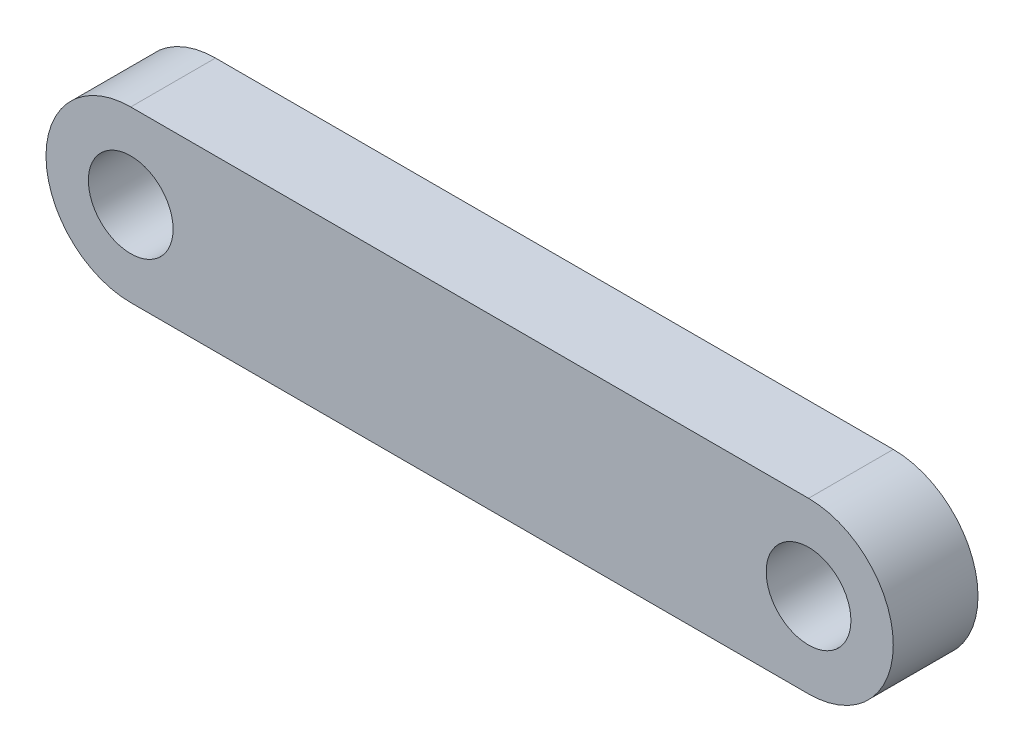
ISO-10303-21;
HEADER;
FILE_DESCRIPTION(('STEP AP214'),'2;1');
FILE_NAME('part.step','',(''),(''),'','','');
FILE_SCHEMA(('AUTOMOTIVE_DESIGN { 1 0 10303 214 1 1 1 1 }'));
ENDSEC;
DATA;
#1=APPLICATION_CONTEXT('core data for automotive mechanical design processes');
#2=APPLICATION_PROTOCOL_DEFINITION('international standard','automotive_design',2000,#1);
#3=PRODUCT_CONTEXT('',#1,'mechanical');
#4=PRODUCT('Part','Part','',(#3));
#5=PRODUCT_RELATED_PRODUCT_CATEGORY('part','',(#4));
#6=PRODUCT_DEFINITION_FORMATION('','',#4);
#7=PRODUCT_DEFINITION_CONTEXT('part definition',#1,'design');
#8=PRODUCT_DEFINITION('design','',#6,#7);
#9=PRODUCT_DEFINITION_SHAPE('','',#8);
#10=(LENGTH_UNIT() NAMED_UNIT(*) SI_UNIT(.MILLI.,.METRE.));
#11=(NAMED_UNIT(*) PLANE_ANGLE_UNIT() SI_UNIT($,.RADIAN.));
#12=(NAMED_UNIT(*) SI_UNIT($,.STERADIAN.) SOLID_ANGLE_UNIT());
#13=UNCERTAINTY_MEASURE_WITH_UNIT(LENGTH_MEASURE(1.E-05),#10,'distance_accuracy_value','');
#14=(GEOMETRIC_REPRESENTATION_CONTEXT(3) GLOBAL_UNCERTAINTY_ASSIGNED_CONTEXT((#13)) GLOBAL_UNIT_ASSIGNED_CONTEXT((#10,
#11,#12)) REPRESENTATION_CONTEXT('',''));
#15=CARTESIAN_POINT('',(0.,0.,0.));
#16=DIRECTION('',(0.,0.,1.));
#17=DIRECTION('',(1.,0.,0.));
#18=AXIS2_PLACEMENT_3D('',#15,#16,#17);
#19=CARTESIAN_POINT('',(-7.99999998935079,0.00041278014118017,2.));
#20=DIRECTION('',(0.,0.,1.));
#21=DIRECTION('',(1.,0.,0.));
#22=AXIS2_PLACEMENT_3D('',#19,#20,#21);
#23=PLANE('',#22);
#24=CARTESIAN_POINT('',(-7.99999998935079,0.00041278014118017,2.));
#25=DIRECTION('',(0.,0.,1.));
#26=DIRECTION('',(1.,0.,0.));
#27=AXIS2_PLACEMENT_3D('',#24,#25,#26);
#28=CIRCLE('',#27,1.);
#29=CARTESIAN_POINT('',(-6.99999998935079,0.00041278014118017,2.));
#30=VERTEX_POINT('',#29);
#31=EDGE_CURVE('E100',#30,#30,#28,.T.);
#32=ORIENTED_EDGE('',*,*,#31,.F.);
#33=EDGE_LOOP('',(#32));
#34=FACE_BOUND('',#33,.T.);
#35=CARTESIAN_POINT('',(-7.99999998935079,0.00041278014118017,2.));
#36=DIRECTION('',(0.,0.,1.));
#37=DIRECTION('',(1.,0.,0.));
#38=AXIS2_PLACEMENT_3D('',#35,#36,#37);
#39=CIRCLE('',#38,2.);
#40=CARTESIAN_POINT('',(-7.99999998935079,2.00041278014118,2.));
#41=VERTEX_POINT('',#40);
#42=CARTESIAN_POINT('',(-7.99999998935079,-1.99958721985882,2.));
#43=VERTEX_POINT('',#42);
#44=EDGE_CURVE('E85',#41,#43,#39,.T.);
#45=ORIENTED_EDGE('',*,*,#44,.T.);
#46=DIRECTION('',(1.,0.,0.));
#47=VECTOR('',#46,1.);
#48=CARTESIAN_POINT('',(-7.99999998935079,-1.99958721985882,2.));
#49=LINE('',#48,#47);
#50=CARTESIAN_POINT('',(8.00000001064921,-1.99958721985882,2.));
#51=VERTEX_POINT('',#50);
#52=EDGE_CURVE('E80',#43,#51,#49,.T.);
#53=ORIENTED_EDGE('',*,*,#52,.T.);
#54=CARTESIAN_POINT('',(8.00000001064921,0.00041278014118017,2.));
#55=DIRECTION('',(0.,0.,1.));
#56=DIRECTION('',(1.,0.,0.));
#57=AXIS2_PLACEMENT_3D('',#54,#55,#56);
#58=CIRCLE('',#57,2.);
#59=CARTESIAN_POINT('',(8.00000001064921,2.00041278014118,2.));
#60=VERTEX_POINT('',#59);
#61=EDGE_CURVE('E83',#51,#60,#58,.T.);
#62=ORIENTED_EDGE('',*,*,#61,.T.);
#63=DIRECTION('',(-1.,0.,0.));
#64=VECTOR('',#63,1.);
#65=CARTESIAN_POINT('',(-7.99999998935079,2.00041278014118,2.));
#66=LINE('',#65,#64);
#67=EDGE_CURVE('E50',#60,#41,#66,.T.);
#68=ORIENTED_EDGE('',*,*,#67,.T.);
#69=EDGE_LOOP('',(#45,#53,#62,#68));
#70=FACE_BOUND('',#69,.T.);
#71=CARTESIAN_POINT('',(8.00000001064921,0.00041278014118017,2.));
#72=DIRECTION('',(0.,0.,1.));
#73=DIRECTION('',(1.,0.,0.));
#74=AXIS2_PLACEMENT_3D('',#71,#72,#73);
#75=CIRCLE('',#74,1.);
#76=CARTESIAN_POINT('',(9.00000001064921,0.00041278014118017,2.));
#77=VERTEX_POINT('',#76);
#78=EDGE_CURVE('E115',#77,#77,#75,.T.);
#79=ORIENTED_EDGE('',*,*,#78,.F.);
#80=EDGE_LOOP('',(#79));
#81=FACE_BOUND('',#80,.T.);
#82=ADVANCED_FACE('F33',(#34,#70,#81),#23,.T.);
#83=CARTESIAN_POINT('',(-7.99999998935079,0.00041278014118017,0.));
#84=DIRECTION('',(0.,0.,1.));
#85=DIRECTION('',(1.,0.,0.));
#86=AXIS2_PLACEMENT_3D('',#83,#84,#85);
#87=PLANE('',#86);
#88=CARTESIAN_POINT('',(-7.99999998935079,0.00041278014118017,0.));
#89=DIRECTION('',(0.,0.,1.));
#90=DIRECTION('',(1.,0.,0.));
#91=AXIS2_PLACEMENT_3D('',#88,#89,#90);
#92=CIRCLE('',#91,2.);
#93=CARTESIAN_POINT('',(-7.99999998935079,2.00041278014118,0.));
#94=VERTEX_POINT('',#93);
#95=CARTESIAN_POINT('',(-7.99999998935079,-1.99958721985882,0.));
#96=VERTEX_POINT('',#95);
#97=EDGE_CURVE('E97',#94,#96,#92,.T.);
#98=ORIENTED_EDGE('',*,*,#97,.F.);
#99=DIRECTION('',(-1.,0.,0.));
#100=VECTOR('',#99,1.);
#101=CARTESIAN_POINT('',(-7.99999998935079,2.00041278014118,0.));
#102=LINE('',#101,#100);
#103=CARTESIAN_POINT('',(8.00000001064921,2.00041278014118,0.));
#104=VERTEX_POINT('',#103);
#105=EDGE_CURVE('E73',#104,#94,#102,.T.);
#106=ORIENTED_EDGE('',*,*,#105,.F.);
#107=CARTESIAN_POINT('',(8.00000001064921,0.00041278014118017,0.));
#108=DIRECTION('',(0.,0.,1.));
#109=DIRECTION('',(1.,0.,0.));
#110=AXIS2_PLACEMENT_3D('',#107,#108,#109);
#111=CIRCLE('',#110,2.);
#112=CARTESIAN_POINT('',(8.00000001064921,-1.99958721985882,0.));
#113=VERTEX_POINT('',#112);
#114=EDGE_CURVE('E67',#113,#104,#111,.T.);
#115=ORIENTED_EDGE('',*,*,#114,.F.);
#116=DIRECTION('',(1.,0.,0.));
#117=VECTOR('',#116,1.);
#118=CARTESIAN_POINT('',(-7.99999998935079,-1.99958721985882,0.));
#119=LINE('',#118,#117);
#120=EDGE_CURVE('E89',#96,#113,#119,.T.);
#121=ORIENTED_EDGE('',*,*,#120,.F.);
#122=EDGE_LOOP('',(#98,#106,#115,#121));
#123=FACE_BOUND('',#122,.T.);
#124=CARTESIAN_POINT('',(-7.99999998935079,0.00041278014118017,0.));
#125=DIRECTION('',(0.,0.,1.));
#126=DIRECTION('',(1.,0.,0.));
#127=AXIS2_PLACEMENT_3D('',#124,#125,#126);
#128=CIRCLE('',#127,1.);
#129=CARTESIAN_POINT('',(-6.99999998935079,0.00041278014118017,0.));
#130=VERTEX_POINT('',#129);
#131=EDGE_CURVE('E112',#130,#130,#128,.T.);
#132=ORIENTED_EDGE('',*,*,#131,.T.);
#133=EDGE_LOOP('',(#132));
#134=FACE_BOUND('',#133,.T.);
#135=CARTESIAN_POINT('',(8.00000001064921,0.00041278014118017,0.));
#136=DIRECTION('',(0.,0.,1.));
#137=DIRECTION('',(1.,0.,0.));
#138=AXIS2_PLACEMENT_3D('',#135,#136,#137);
#139=CIRCLE('',#138,1.);
#140=CARTESIAN_POINT('',(9.00000001064921,0.00041278014118017,0.));
#141=VERTEX_POINT('',#140);
#142=EDGE_CURVE('E118',#141,#141,#139,.T.);
#143=ORIENTED_EDGE('',*,*,#142,.T.);
#144=EDGE_LOOP('',(#143));
#145=FACE_BOUND('',#144,.T.);
#146=ADVANCED_FACE('F108',(#123,#134,#145),#87,.F.);
#147=CARTESIAN_POINT('',(-7.99999998935079,0.00041278014118017,2.));
#148=DIRECTION('',(0.,0.,-1.));
#149=DIRECTION('',(-1.,0.,0.));
#150=AXIS2_PLACEMENT_3D('',#147,#148,#149);
#151=CYLINDRICAL_SURFACE('',#150,2.);
#152=ORIENTED_EDGE('',*,*,#97,.T.);
#153=DIRECTION('',(0.,0.,-1.));
#154=VECTOR('',#153,1.);
#155=CARTESIAN_POINT('',(-7.99999998935079,-1.99958721985882,2.));
#156=LINE('',#155,#154);
#157=EDGE_CURVE('E11',#43,#96,#156,.T.);
#158=ORIENTED_EDGE('',*,*,#157,.F.);
#159=ORIENTED_EDGE('',*,*,#44,.F.);
#160=DIRECTION('',(0.,0.,-1.));
#161=VECTOR('',#160,1.);
#162=CARTESIAN_POINT('',(-7.99999998935079,2.00041278014118,2.));
#163=LINE('',#162,#161);
#164=EDGE_CURVE('E93',#41,#94,#163,.T.);
#165=ORIENTED_EDGE('',*,*,#164,.T.);
#166=EDGE_LOOP('',(#152,#158,#159,#165));
#167=FACE_BOUND('',#166,.T.);
#168=ADVANCED_FACE('F35',(#167),#151,.T.);
#169=CARTESIAN_POINT('',(-7.99999998935079,-1.99958721985882,2.));
#170=DIRECTION('',(0.,1.,0.));
#171=DIRECTION('',(0.,0.,1.));
#172=AXIS2_PLACEMENT_3D('',#169,#170,#171);
#173=PLANE('',#172);
#174=ORIENTED_EDGE('',*,*,#120,.T.);
#175=DIRECTION('',(0.,0.,-1.));
#176=VECTOR('',#175,1.);
#177=CARTESIAN_POINT('',(8.00000001064921,-1.99958721985882,2.));
#178=LINE('',#177,#176);
#179=EDGE_CURVE('E42',#51,#113,#178,.T.);
#180=ORIENTED_EDGE('',*,*,#179,.F.);
#181=ORIENTED_EDGE('',*,*,#52,.F.);
#182=ORIENTED_EDGE('',*,*,#157,.T.);
#183=EDGE_LOOP('',(#174,#180,#181,#182));
#184=FACE_BOUND('',#183,.T.);
#185=ADVANCED_FACE('F88',(#184),#173,.F.);
#186=CARTESIAN_POINT('',(8.00000001064921,0.00041278014118017,2.));
#187=DIRECTION('',(0.,0.,-1.));
#188=DIRECTION('',(-1.,0.,0.));
#189=AXIS2_PLACEMENT_3D('',#186,#187,#188);
#190=CYLINDRICAL_SURFACE('',#189,2.);
#191=ORIENTED_EDGE('',*,*,#114,.T.);
#192=DIRECTION('',(0.,0.,-1.));
#193=VECTOR('',#192,1.);
#194=CARTESIAN_POINT('',(8.00000001064921,2.00041278014118,2.));
#195=LINE('',#194,#193);
#196=EDGE_CURVE('E90',#60,#104,#195,.T.);
#197=ORIENTED_EDGE('',*,*,#196,.F.);
#198=ORIENTED_EDGE('',*,*,#61,.F.);
#199=ORIENTED_EDGE('',*,*,#179,.T.);
#200=EDGE_LOOP('',(#191,#197,#198,#199));
#201=FACE_BOUND('',#200,.T.);
#202=ADVANCED_FACE('F91',(#201),#190,.T.);
#203=CARTESIAN_POINT('',(-7.99999998935079,2.00041278014118,2.));
#204=DIRECTION('',(0.,-1.,0.));
#205=DIRECTION('',(0.,0.,-1.));
#206=AXIS2_PLACEMENT_3D('',#203,#204,#205);
#207=PLANE('',#206);
#208=ORIENTED_EDGE('',*,*,#105,.T.);
#209=ORIENTED_EDGE('',*,*,#164,.F.);
#210=ORIENTED_EDGE('',*,*,#67,.F.);
#211=ORIENTED_EDGE('',*,*,#196,.T.);
#212=EDGE_LOOP('',(#208,#209,#210,#211));
#213=FACE_BOUND('',#212,.T.);
#214=ADVANCED_FACE('F105',(#213),#207,.F.);
#215=CARTESIAN_POINT('',(-7.99999998935079,0.00041278014118017,2.));
#216=DIRECTION('',(0.,0.,-1.));
#217=DIRECTION('',(-1.,0.,0.));
#218=AXIS2_PLACEMENT_3D('',#215,#216,#217);
#219=CYLINDRICAL_SURFACE('',#218,1.);
#220=ORIENTED_EDGE('',*,*,#31,.T.);
#221=EDGE_LOOP('',(#220));
#222=FACE_BOUND('',#221,.T.);
#223=ORIENTED_EDGE('',*,*,#131,.F.);
#224=EDGE_LOOP('',(#223));
#225=FACE_BOUND('',#224,.T.);
#226=ADVANCED_FACE('F135',(#222,#225),#219,.F.);
#227=CARTESIAN_POINT('',(8.00000001064921,0.00041278014118017,2.));
#228=DIRECTION('',(0.,0.,-1.));
#229=DIRECTION('',(-1.,0.,0.));
#230=AXIS2_PLACEMENT_3D('',#227,#228,#229);
#231=CYLINDRICAL_SURFACE('',#230,1.);
#232=ORIENTED_EDGE('',*,*,#78,.T.);
#233=EDGE_LOOP('',(#232));
#234=FACE_BOUND('',#233,.T.);
#235=ORIENTED_EDGE('',*,*,#142,.F.);
#236=EDGE_LOOP('',(#235));
#237=FACE_BOUND('',#236,.T.);
#238=ADVANCED_FACE('F124',(#234,#237),#231,.F.);
#239=CLOSED_SHELL('',(#82,#146,#168,#185,#202,#214,#226,#238));
#240=MANIFOLD_SOLID_BREP('B2',#239);
#241=ADVANCED_BREP_SHAPE_REPRESENTATION('',(#18,#240),#14);
#242=SHAPE_DEFINITION_REPRESENTATION(#9,#241);
ENDSEC;
END-ISO-10303-21;
